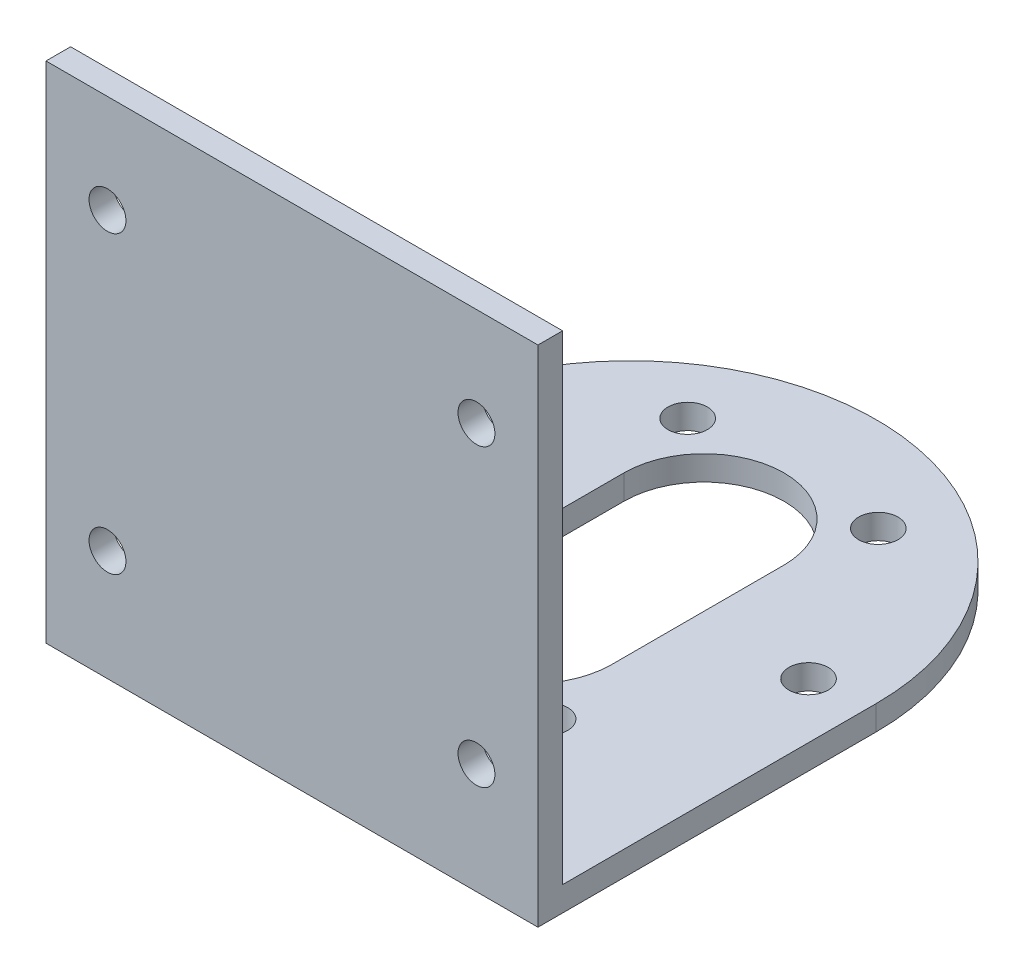
ISO-10303-21;
HEADER;
FILE_DESCRIPTION(('STEP AP214'),'2;1');
FILE_NAME('part.step','',(''),(''),'','','');
FILE_SCHEMA(('AUTOMOTIVE_DESIGN { 1 0 10303 214 1 1 1 1 }'));
ENDSEC;
DATA;
#1=APPLICATION_CONTEXT('core data for automotive mechanical design processes');
#2=APPLICATION_PROTOCOL_DEFINITION('international standard','automotive_design',2000,#1);
#3=PRODUCT_CONTEXT('',#1,'mechanical');
#4=PRODUCT('Part','Part','',(#3));
#5=PRODUCT_RELATED_PRODUCT_CATEGORY('part','',(#4));
#6=PRODUCT_DEFINITION_FORMATION('','',#4);
#7=PRODUCT_DEFINITION_CONTEXT('part definition',#1,'design');
#8=PRODUCT_DEFINITION('design','',#6,#7);
#9=PRODUCT_DEFINITION_SHAPE('','',#8);
#10=(LENGTH_UNIT() NAMED_UNIT(*) SI_UNIT(.MILLI.,.METRE.));
#11=(NAMED_UNIT(*) PLANE_ANGLE_UNIT() SI_UNIT($,.RADIAN.));
#12=(NAMED_UNIT(*) SI_UNIT($,.STERADIAN.) SOLID_ANGLE_UNIT());
#13=UNCERTAINTY_MEASURE_WITH_UNIT(LENGTH_MEASURE(1.E-05),#10,'distance_accuracy_value','');
#14=(GEOMETRIC_REPRESENTATION_CONTEXT(3) GLOBAL_UNCERTAINTY_ASSIGNED_CONTEXT((#13)) GLOBAL_UNIT_ASSIGNED_CONTEXT((#10,
#11,#12)) REPRESENTATION_CONTEXT('',''));
#15=CARTESIAN_POINT('',(0.,0.,0.));
#16=DIRECTION('',(0.,0.,1.));
#17=DIRECTION('',(1.,0.,0.));
#18=AXIS2_PLACEMENT_3D('',#15,#16,#17);
#19=CARTESIAN_POINT('',(-1.95819738407242,2.,2.1643234245011));
#20=DIRECTION('',(0.,1.,0.));
#21=DIRECTION('',(0.,0.,1.));
#22=AXIS2_PLACEMENT_3D('',#19,#20,#21);
#23=PLANE('',#22);
#24=DIRECTION('',(-1.,0.,0.));
#25=VECTOR('',#24,1.);
#26=CARTESIAN_POINT('',(-21.9581973840724,2.,27.6643234245011));
#27=LINE('',#26,#25);
#28=CARTESIAN_POINT('',(18.0418026159276,2.,27.6643234245011));
#29=VERTEX_POINT('',#28);
#30=CARTESIAN_POINT('',(-21.9581973840724,2.,27.6643234245011));
#31=VERTEX_POINT('',#30);
#32=EDGE_CURVE('E55',#29,#31,#27,.T.);
#33=ORIENTED_EDGE('',*,*,#32,.F.);
#34=DIRECTION('',(0.,0.,-1.));
#35=VECTOR('',#34,1.);
#36=CARTESIAN_POINT('',(18.0418026159276,2.,29.6643234245011));
#37=LINE('',#36,#35);
#38=CARTESIAN_POINT('',(18.0418026159276,2.,2.1643234245011));
#39=VERTEX_POINT('',#38);
#40=EDGE_CURVE('E258',#29,#39,#37,.T.);
#41=ORIENTED_EDGE('',*,*,#40,.T.);
#42=CARTESIAN_POINT('',(-1.95819738407242,2.,2.1643234245011));
#43=DIRECTION('',(0.,1.,0.));
#44=DIRECTION('',(0.,0.,1.));
#45=AXIS2_PLACEMENT_3D('',#42,#43,#44);
#46=CIRCLE('',#45,20.);
#47=CARTESIAN_POINT('',(-21.9581973840724,2.,2.1643234245011));
#48=VERTEX_POINT('',#47);
#49=EDGE_CURVE('E250',#39,#48,#46,.T.);
#50=ORIENTED_EDGE('',*,*,#49,.T.);
#51=DIRECTION('',(0.,0.,1.));
#52=VECTOR('',#51,1.);
#53=CARTESIAN_POINT('',(-21.9581973840724,2.,2.1643234245011));
#54=LINE('',#53,#52);
#55=EDGE_CURVE('E254',#48,#31,#54,.T.);
#56=ORIENTED_EDGE('',*,*,#55,.T.);
#57=EDGE_LOOP('',(#33,#41,#50,#56));
#58=FACE_BOUND('',#57,.T.);
#59=CARTESIAN_POINT('',(13.5418026159276,2.,3.1643234245011));
#60=DIRECTION('',(0.,1.,0.));
#61=DIRECTION('',(0.,0.,1.));
#62=AXIS2_PLACEMENT_3D('',#59,#60,#61);
#63=CIRCLE('',#62,1.6);
#64=CARTESIAN_POINT('',(13.5418026159276,2.,4.7643234245011));
#65=VERTEX_POINT('',#64);
#66=EDGE_CURVE('E210',#65,#65,#63,.T.);
#67=ORIENTED_EDGE('',*,*,#66,.F.);
#68=EDGE_LOOP('',(#67));
#69=FACE_BOUND('',#68,.T.);
#70=CARTESIAN_POINT('',(-9.70819738407242,2.,16.5877171831599));
#71=DIRECTION('',(0.,1.,0.));
#72=DIRECTION('',(0.,0.,1.));
#73=AXIS2_PLACEMENT_3D('',#70,#71,#72);
#74=CIRCLE('',#73,1.6);
#75=CARTESIAN_POINT('',(-9.70819738407242,2.,18.1877171831599));
#76=VERTEX_POINT('',#75);
#77=EDGE_CURVE('E226',#76,#76,#74,.T.);
#78=ORIENTED_EDGE('',*,*,#77,.F.);
#79=EDGE_LOOP('',(#78));
#80=FACE_BOUND('',#79,.T.);
#81=CARTESIAN_POINT('',(-9.70819738407242,2.,-10.2590703341577));
#82=DIRECTION('',(0.,1.,0.));
#83=DIRECTION('',(0.,0.,1.));
#84=AXIS2_PLACEMENT_3D('',#81,#82,#83);
#85=CIRCLE('',#84,1.6);
#86=CARTESIAN_POINT('',(-9.70819738407242,2.,-8.65907033415769));
#87=VERTEX_POINT('',#86);
#88=EDGE_CURVE('E242',#87,#87,#85,.T.);
#89=ORIENTED_EDGE('',*,*,#88,.F.);
#90=EDGE_LOOP('',(#89));
#91=FACE_BOUND('',#90,.T.);
#92=CARTESIAN_POINT('',(-17.4581973840724,2.,3.1643234245011));
#93=DIRECTION('',(0.,1.,0.));
#94=DIRECTION('',(0.,0.,1.));
#95=AXIS2_PLACEMENT_3D('',#92,#93,#94);
#96=CIRCLE('',#95,1.6);
#97=CARTESIAN_POINT('',(-17.4581973840724,2.,4.7643234245011));
#98=VERTEX_POINT('',#97);
#99=EDGE_CURVE('E234',#98,#98,#96,.T.);
#100=ORIENTED_EDGE('',*,*,#99,.F.);
#101=EDGE_LOOP('',(#100));
#102=FACE_BOUND('',#101,.T.);
#103=CARTESIAN_POINT('',(5.79180261592758,2.,16.5877171831599));
#104=DIRECTION('',(0.,1.,0.));
#105=DIRECTION('',(0.,0.,1.));
#106=AXIS2_PLACEMENT_3D('',#103,#104,#105);
#107=CIRCLE('',#106,1.6);
#108=CARTESIAN_POINT('',(5.79180261592758,2.,18.1877171831599));
#109=VERTEX_POINT('',#108);
#110=EDGE_CURVE('E218',#109,#109,#107,.T.);
#111=ORIENTED_EDGE('',*,*,#110,.F.);
#112=EDGE_LOOP('',(#111));
#113=FACE_BOUND('',#112,.T.);
#114=CARTESIAN_POINT('',(5.79180261592758,2.,-10.2590703341577));
#115=DIRECTION('',(0.,1.,0.));
#116=DIRECTION('',(0.,0.,1.));
#117=AXIS2_PLACEMENT_3D('',#114,#115,#116);
#118=CIRCLE('',#117,1.6);
#119=CARTESIAN_POINT('',(5.79180261592758,2.,-8.65907033415769));
#120=VERTEX_POINT('',#119);
#121=EDGE_CURVE('E202',#120,#120,#118,.T.);
#122=ORIENTED_EDGE('',*,*,#121,.F.);
#123=EDGE_LOOP('',(#122));
#124=FACE_BOUND('',#123,.T.);
#125=DIRECTION('',(0.,0.,1.));
#126=VECTOR('',#125,1.);
#127=CARTESIAN_POINT('',(-8.45819738407242,2.,-3.83567657549889));
#128=LINE('',#127,#126);
#129=CARTESIAN_POINT('',(-8.45819738407242,2.,-3.83567657549889));
#130=VERTEX_POINT('',#129);
#131=CARTESIAN_POINT('',(-8.45819738407242,2.,10.1643234245011));
#132=VERTEX_POINT('',#131);
#133=EDGE_CURVE('E164',#130,#132,#128,.T.);
#134=ORIENTED_EDGE('',*,*,#133,.F.);
#135=CARTESIAN_POINT('',(-1.95819738407242,2.,-3.83567657549889));
#136=DIRECTION('',(0.,1.,0.));
#137=DIRECTION('',(0.,0.,1.));
#138=AXIS2_PLACEMENT_3D('',#135,#136,#137);
#139=CIRCLE('',#138,6.5);
#140=CARTESIAN_POINT('',(4.54180261592758,2.,-3.83567657549889));
#141=VERTEX_POINT('',#140);
#142=EDGE_CURVE('E161',#141,#130,#139,.T.);
#143=ORIENTED_EDGE('',*,*,#142,.F.);
#144=DIRECTION('',(0.,0.,-1.));
#145=VECTOR('',#144,1.);
#146=CARTESIAN_POINT('',(4.54180261592758,2.,-3.83567657549889));
#147=LINE('',#146,#145);
#148=CARTESIAN_POINT('',(4.54180261592758,2.,10.1643234245011));
#149=VERTEX_POINT('',#148);
#150=EDGE_CURVE('E171',#149,#141,#147,.T.);
#151=ORIENTED_EDGE('',*,*,#150,.F.);
#152=CARTESIAN_POINT('',(-1.95819738407242,2.,10.1643234245011));
#153=DIRECTION('',(0.,1.,0.));
#154=DIRECTION('',(0.,0.,1.));
#155=AXIS2_PLACEMENT_3D('',#152,#153,#154);
#156=CIRCLE('',#155,6.5);
#157=EDGE_CURVE('E168',#132,#149,#156,.T.);
#158=ORIENTED_EDGE('',*,*,#157,.F.);
#159=EDGE_LOOP('',(#134,#143,#151,#158));
#160=FACE_BOUND('',#159,.T.);
#161=ADVANCED_FACE('F39',(#58,#69,#80,#91,#102,#113,#124,#160),#23,.T.);
#162=CARTESIAN_POINT('',(-1.95819738407242,0.,2.1643234245011));
#163=DIRECTION('',(0.,1.,0.));
#164=DIRECTION('',(0.,0.,1.));
#165=AXIS2_PLACEMENT_3D('',#162,#163,#164);
#166=PLANE('',#165);
#167=CARTESIAN_POINT('',(5.79180261592758,0.,-10.2590703341577));
#168=DIRECTION('',(0.,1.,0.));
#169=DIRECTION('',(0.,0.,1.));
#170=AXIS2_PLACEMENT_3D('',#167,#168,#169);
#171=CIRCLE('',#170,1.6);
#172=CARTESIAN_POINT('',(5.79180261592758,0.,-8.65907033415769));
#173=VERTEX_POINT('',#172);
#174=EDGE_CURVE('E201',#173,#173,#171,.T.);
#175=ORIENTED_EDGE('',*,*,#174,.T.);
#176=EDGE_LOOP('',(#175));
#177=FACE_BOUND('',#176,.T.);
#178=CARTESIAN_POINT('',(13.5418026159276,0.,3.1643234245011));
#179=DIRECTION('',(0.,1.,0.));
#180=DIRECTION('',(0.,0.,1.));
#181=AXIS2_PLACEMENT_3D('',#178,#179,#180);
#182=CIRCLE('',#181,1.6);
#183=CARTESIAN_POINT('',(13.5418026159276,0.,4.7643234245011));
#184=VERTEX_POINT('',#183);
#185=EDGE_CURVE('E206',#184,#184,#182,.T.);
#186=ORIENTED_EDGE('',*,*,#185,.T.);
#187=EDGE_LOOP('',(#186));
#188=FACE_BOUND('',#187,.T.);
#189=CARTESIAN_POINT('',(5.79180261592758,0.,16.5877171831599));
#190=DIRECTION('',(0.,1.,0.));
#191=DIRECTION('',(0.,0.,1.));
#192=AXIS2_PLACEMENT_3D('',#189,#190,#191);
#193=CIRCLE('',#192,1.6);
#194=CARTESIAN_POINT('',(5.79180261592758,0.,18.1877171831599));
#195=VERTEX_POINT('',#194);
#196=EDGE_CURVE('E214',#195,#195,#193,.T.);
#197=ORIENTED_EDGE('',*,*,#196,.T.);
#198=EDGE_LOOP('',(#197));
#199=FACE_BOUND('',#198,.T.);
#200=CARTESIAN_POINT('',(-9.70819738407242,0.,16.5877171831599));
#201=DIRECTION('',(0.,1.,0.));
#202=DIRECTION('',(0.,0.,1.));
#203=AXIS2_PLACEMENT_3D('',#200,#201,#202);
#204=CIRCLE('',#203,1.6);
#205=CARTESIAN_POINT('',(-9.70819738407242,0.,18.1877171831599));
#206=VERTEX_POINT('',#205);
#207=EDGE_CURVE('E222',#206,#206,#204,.T.);
#208=ORIENTED_EDGE('',*,*,#207,.T.);
#209=EDGE_LOOP('',(#208));
#210=FACE_BOUND('',#209,.T.);
#211=CARTESIAN_POINT('',(-17.4581973840724,0.,3.1643234245011));
#212=DIRECTION('',(0.,1.,0.));
#213=DIRECTION('',(0.,0.,1.));
#214=AXIS2_PLACEMENT_3D('',#211,#212,#213);
#215=CIRCLE('',#214,1.6);
#216=CARTESIAN_POINT('',(-17.4581973840724,0.,4.7643234245011));
#217=VERTEX_POINT('',#216);
#218=EDGE_CURVE('E230',#217,#217,#215,.T.);
#219=ORIENTED_EDGE('',*,*,#218,.T.);
#220=EDGE_LOOP('',(#219));
#221=FACE_BOUND('',#220,.T.);
#222=CARTESIAN_POINT('',(-9.70819738407242,0.,-10.2590703341577));
#223=DIRECTION('',(0.,1.,0.));
#224=DIRECTION('',(0.,0.,1.));
#225=AXIS2_PLACEMENT_3D('',#222,#223,#224);
#226=CIRCLE('',#225,1.6);
#227=CARTESIAN_POINT('',(-9.70819738407242,0.,-8.65907033415769));
#228=VERTEX_POINT('',#227);
#229=EDGE_CURVE('E238',#228,#228,#226,.T.);
#230=ORIENTED_EDGE('',*,*,#229,.T.);
#231=EDGE_LOOP('',(#230));
#232=FACE_BOUND('',#231,.T.);
#233=CARTESIAN_POINT('',(-1.95819738407242,0.,2.1643234245011));
#234=DIRECTION('',(0.,1.,0.));
#235=DIRECTION('',(0.,0.,1.));
#236=AXIS2_PLACEMENT_3D('',#233,#234,#235);
#237=CIRCLE('',#236,20.);
#238=CARTESIAN_POINT('',(18.0418026159276,0.,2.1643234245011));
#239=VERTEX_POINT('',#238);
#240=CARTESIAN_POINT('',(-21.9581973840724,0.,2.1643234245011));
#241=VERTEX_POINT('',#240);
#242=EDGE_CURVE('E246',#239,#241,#237,.T.);
#243=ORIENTED_EDGE('',*,*,#242,.F.);
#244=DIRECTION('',(0.,0.,-1.));
#245=VECTOR('',#244,1.);
#246=CARTESIAN_POINT('',(18.0418026159276,0.,29.6643234245011));
#247=LINE('',#246,#245);
#248=CARTESIAN_POINT('',(18.0418026159276,0.,29.6643234245011));
#249=VERTEX_POINT('',#248);
#250=EDGE_CURVE('E255',#249,#239,#247,.T.);
#251=ORIENTED_EDGE('',*,*,#250,.F.);
#252=DIRECTION('',(1.,0.,0.));
#253=VECTOR('',#252,1.);
#254=CARTESIAN_POINT('',(-21.9581973840724,0.,29.6643234245011));
#255=LINE('',#254,#253);
#256=CARTESIAN_POINT('',(-21.9581973840724,0.,29.6643234245011));
#257=VERTEX_POINT('',#256);
#258=EDGE_CURVE('E267',#257,#249,#255,.T.);
#259=ORIENTED_EDGE('',*,*,#258,.F.);
#260=DIRECTION('',(0.,0.,1.));
#261=VECTOR('',#260,1.);
#262=CARTESIAN_POINT('',(-21.9581973840724,0.,2.1643234245011));
#263=LINE('',#262,#261);
#264=EDGE_CURVE('E122',#241,#257,#263,.T.);
#265=ORIENTED_EDGE('',*,*,#264,.F.);
#266=EDGE_LOOP('',(#243,#251,#259,#265));
#267=FACE_BOUND('',#266,.T.);
#268=CARTESIAN_POINT('',(-1.95819738407242,0.,-3.83567657549889));
#269=DIRECTION('',(0.,1.,0.));
#270=DIRECTION('',(0.,0.,1.));
#271=AXIS2_PLACEMENT_3D('',#268,#269,#270);
#272=CIRCLE('',#271,6.5);
#273=CARTESIAN_POINT('',(4.54180261592758,0.,-3.83567657549889));
#274=VERTEX_POINT('',#273);
#275=CARTESIAN_POINT('',(-8.45819738407242,0.,-3.83567657549889));
#276=VERTEX_POINT('',#275);
#277=EDGE_CURVE('E160',#274,#276,#272,.T.);
#278=ORIENTED_EDGE('',*,*,#277,.T.);
#279=DIRECTION('',(0.,0.,1.));
#280=VECTOR('',#279,1.);
#281=CARTESIAN_POINT('',(-8.45819738407242,0.,-3.83567657549889));
#282=LINE('',#281,#280);
#283=CARTESIAN_POINT('',(-8.45819738407242,0.,10.1643234245011));
#284=VERTEX_POINT('',#283);
#285=EDGE_CURVE('E178',#276,#284,#282,.T.);
#286=ORIENTED_EDGE('',*,*,#285,.T.);
#287=CARTESIAN_POINT('',(-1.95819738407242,0.,10.1643234245011));
#288=DIRECTION('',(0.,1.,0.));
#289=DIRECTION('',(0.,0.,1.));
#290=AXIS2_PLACEMENT_3D('',#287,#288,#289);
#291=CIRCLE('',#290,6.5);
#292=CARTESIAN_POINT('',(4.54180261592758,0.,10.1643234245011));
#293=VERTEX_POINT('',#292);
#294=EDGE_CURVE('E182',#284,#293,#291,.T.);
#295=ORIENTED_EDGE('',*,*,#294,.T.);
#296=DIRECTION('',(0.,0.,-1.));
#297=VECTOR('',#296,1.);
#298=CARTESIAN_POINT('',(4.54180261592758,0.,-3.83567657549889));
#299=LINE('',#298,#297);
#300=EDGE_CURVE('E165',#293,#274,#299,.T.);
#301=ORIENTED_EDGE('',*,*,#300,.T.);
#302=EDGE_LOOP('',(#278,#286,#295,#301));
#303=FACE_BOUND('',#302,.T.);
#304=ADVANCED_FACE('F283',(#177,#188,#199,#210,#221,#232,#267,#303),#166,.F.);
#305=CARTESIAN_POINT('',(-1.95819738407242,2.,2.1643234245011));
#306=DIRECTION('',(0.,-1.,0.));
#307=DIRECTION('',(0.,0.,-1.));
#308=AXIS2_PLACEMENT_3D('',#305,#306,#307);
#309=CYLINDRICAL_SURFACE('',#308,20.);
#310=ORIENTED_EDGE('',*,*,#242,.T.);
#311=DIRECTION('',(0.,-1.,0.));
#312=VECTOR('',#311,1.);
#313=CARTESIAN_POINT('',(-21.9581973840724,2.,2.1643234245011));
#314=LINE('',#313,#312);
#315=EDGE_CURVE('E11',#48,#241,#314,.T.);
#316=ORIENTED_EDGE('',*,*,#315,.F.);
#317=ORIENTED_EDGE('',*,*,#49,.F.);
#318=DIRECTION('',(0.,-1.,0.));
#319=VECTOR('',#318,1.);
#320=CARTESIAN_POINT('',(18.0418026159276,2.,2.1643234245011));
#321=LINE('',#320,#319);
#322=EDGE_CURVE('E261',#39,#239,#321,.T.);
#323=ORIENTED_EDGE('',*,*,#322,.T.);
#324=EDGE_LOOP('',(#310,#316,#317,#323));
#325=FACE_BOUND('',#324,.T.);
#326=ADVANCED_FACE('F41',(#325),#309,.T.);
#327=CARTESIAN_POINT('',(-21.9581973840724,2.,2.1643234245011));
#328=DIRECTION('',(1.,0.,0.));
#329=DIRECTION('',(0.,0.,-1.));
#330=AXIS2_PLACEMENT_3D('',#327,#328,#329);
#331=PLANE('',#330);
#332=ORIENTED_EDGE('',*,*,#264,.T.);
#333=DIRECTION('',(0.,-1.,0.));
#334=VECTOR('',#333,1.);
#335=CARTESIAN_POINT('',(-21.9581973840724,2.,29.6643234245011));
#336=LINE('',#335,#334);
#337=CARTESIAN_POINT('',(-21.9581973840724,41.,29.6643234245011));
#338=VERTEX_POINT('',#337);
#339=EDGE_CURVE('E48',#338,#257,#336,.T.);
#340=ORIENTED_EDGE('',*,*,#339,.F.);
#341=DIRECTION('',(0.,0.,1.));
#342=VECTOR('',#341,1.);
#343=CARTESIAN_POINT('',(-21.9581973840724,41.,29.6643234245011));
#344=LINE('',#343,#342);
#345=CARTESIAN_POINT('',(-21.9581973840724,41.,27.6643234245011));
#346=VERTEX_POINT('',#345);
#347=EDGE_CURVE('E121',#346,#338,#344,.T.);
#348=ORIENTED_EDGE('',*,*,#347,.F.);
#349=DIRECTION('',(0.,-1.,0.));
#350=VECTOR('',#349,1.);
#351=CARTESIAN_POINT('',(-21.9581973840724,41.,27.6643234245011));
#352=LINE('',#351,#350);
#353=EDGE_CURVE('E152',#346,#31,#352,.T.);
#354=ORIENTED_EDGE('',*,*,#353,.T.);
#355=ORIENTED_EDGE('',*,*,#55,.F.);
#356=ORIENTED_EDGE('',*,*,#315,.T.);
#357=EDGE_LOOP('',(#332,#340,#348,#354,#355,#356));
#358=FACE_BOUND('',#357,.T.);
#359=ADVANCED_FACE('F118',(#358),#331,.F.);
#360=CARTESIAN_POINT('',(-21.9581973840724,2.,29.6643234245011));
#361=DIRECTION('',(0.,0.,-1.));
#362=DIRECTION('',(-1.,0.,0.));
#363=AXIS2_PLACEMENT_3D('',#360,#361,#362);
#364=PLANE('',#363);
#365=CARTESIAN_POINT('',(13.0418026159276,9.,29.6643234245011));
#366=DIRECTION('',(0.,0.,-1.));
#367=DIRECTION('',(-1.,0.,0.));
#368=AXIS2_PLACEMENT_3D('',#365,#366,#367);
#369=CIRCLE('',#368,1.5);
#370=CARTESIAN_POINT('',(11.5418026159276,9.,29.6643234245011));
#371=VERTEX_POINT('',#370);
#372=EDGE_CURVE('E463',#371,#371,#369,.T.);
#373=ORIENTED_EDGE('',*,*,#372,.T.);
#374=EDGE_LOOP('',(#373));
#375=FACE_BOUND('',#374,.T.);
#376=CARTESIAN_POINT('',(-16.9581973840724,33.,29.6643234245011));
#377=DIRECTION('',(0.,0.,-1.));
#378=DIRECTION('',(-1.,0.,0.));
#379=AXIS2_PLACEMENT_3D('',#376,#377,#378);
#380=CIRCLE('',#379,1.5);
#381=CARTESIAN_POINT('',(-18.4581973840724,33.,29.6643234245011));
#382=VERTEX_POINT('',#381);
#383=EDGE_CURVE('E468',#382,#382,#380,.T.);
#384=ORIENTED_EDGE('',*,*,#383,.T.);
#385=EDGE_LOOP('',(#384));
#386=FACE_BOUND('',#385,.T.);
#387=CARTESIAN_POINT('',(-16.9581973840724,9.,29.6643234245011));
#388=DIRECTION('',(0.,0.,-1.));
#389=DIRECTION('',(-1.,0.,0.));
#390=AXIS2_PLACEMENT_3D('',#387,#388,#389);
#391=CIRCLE('',#390,1.5);
#392=CARTESIAN_POINT('',(-18.4581973840724,9.,29.6643234245011));
#393=VERTEX_POINT('',#392);
#394=EDGE_CURVE('E480',#393,#393,#391,.T.);
#395=ORIENTED_EDGE('',*,*,#394,.T.);
#396=EDGE_LOOP('',(#395));
#397=FACE_BOUND('',#396,.T.);
#398=CARTESIAN_POINT('',(13.0418026159276,33.,29.6643234245011));
#399=DIRECTION('',(0.,0.,-1.));
#400=DIRECTION('',(-1.,0.,0.));
#401=AXIS2_PLACEMENT_3D('',#398,#399,#400);
#402=CIRCLE('',#401,1.5);
#403=CARTESIAN_POINT('',(11.5418026159276,33.,29.6643234245011));
#404=VERTEX_POINT('',#403);
#405=EDGE_CURVE('E143',#404,#404,#402,.T.);
#406=ORIENTED_EDGE('',*,*,#405,.T.);
#407=EDGE_LOOP('',(#406));
#408=FACE_BOUND('',#407,.T.);
#409=ORIENTED_EDGE('',*,*,#258,.T.);
#410=DIRECTION('',(0.,-1.,0.));
#411=VECTOR('',#410,1.);
#412=CARTESIAN_POINT('',(18.0418026159276,2.,29.6643234245011));
#413=LINE('',#412,#411);
#414=CARTESIAN_POINT('',(18.0418026159276,41.,29.6643234245011));
#415=VERTEX_POINT('',#414);
#416=EDGE_CURVE('E126',#415,#249,#413,.T.);
#417=ORIENTED_EDGE('',*,*,#416,.F.);
#418=DIRECTION('',(1.,0.,0.));
#419=VECTOR('',#418,1.);
#420=CARTESIAN_POINT('',(-21.9581973840724,41.,29.6643234245011));
#421=LINE('',#420,#419);
#422=EDGE_CURVE('E128',#338,#415,#421,.T.);
#423=ORIENTED_EDGE('',*,*,#422,.F.);
#424=ORIENTED_EDGE('',*,*,#339,.T.);
#425=EDGE_LOOP('',(#409,#417,#423,#424));
#426=FACE_BOUND('',#425,.T.);
#427=ADVANCED_FACE('F129',(#375,#386,#397,#408,#426),#364,.F.);
#428=CARTESIAN_POINT('',(18.0418026159276,2.,29.6643234245011));
#429=DIRECTION('',(-1.,0.,0.));
#430=DIRECTION('',(0.,0.,1.));
#431=AXIS2_PLACEMENT_3D('',#428,#429,#430);
#432=PLANE('',#431);
#433=ORIENTED_EDGE('',*,*,#250,.T.);
#434=ORIENTED_EDGE('',*,*,#322,.F.);
#435=ORIENTED_EDGE('',*,*,#40,.F.);
#436=DIRECTION('',(0.,-1.,0.));
#437=VECTOR('',#436,1.);
#438=CARTESIAN_POINT('',(18.0418026159276,41.,27.6643234245011));
#439=LINE('',#438,#437);
#440=CARTESIAN_POINT('',(18.0418026159276,41.,27.6643234245011));
#441=VERTEX_POINT('',#440);
#442=EDGE_CURVE('E156',#441,#29,#439,.T.);
#443=ORIENTED_EDGE('',*,*,#442,.F.);
#444=DIRECTION('',(0.,0.,-1.));
#445=VECTOR('',#444,1.);
#446=CARTESIAN_POINT('',(18.0418026159276,41.,29.6643234245011));
#447=LINE('',#446,#445);
#448=EDGE_CURVE('E134',#415,#441,#447,.T.);
#449=ORIENTED_EDGE('',*,*,#448,.F.);
#450=ORIENTED_EDGE('',*,*,#416,.T.);
#451=EDGE_LOOP('',(#433,#434,#435,#443,#449,#450));
#452=FACE_BOUND('',#451,.T.);
#453=ADVANCED_FACE('F278',(#452),#432,.F.);
#454=CARTESIAN_POINT('',(-9.70819738407242,2.,-10.2590703341577));
#455=DIRECTION('',(0.,-1.,0.));
#456=DIRECTION('',(0.,0.,-1.));
#457=AXIS2_PLACEMENT_3D('',#454,#455,#456);
#458=CYLINDRICAL_SURFACE('',#457,1.6);
#459=ORIENTED_EDGE('',*,*,#88,.T.);
#460=EDGE_LOOP('',(#459));
#461=FACE_BOUND('',#460,.T.);
#462=ORIENTED_EDGE('',*,*,#229,.F.);
#463=EDGE_LOOP('',(#462));
#464=FACE_BOUND('',#463,.T.);
#465=ADVANCED_FACE('F354',(#461,#464),#458,.F.);
#466=CARTESIAN_POINT('',(-17.4581973840724,2.,3.1643234245011));
#467=DIRECTION('',(0.,-1.,0.));
#468=DIRECTION('',(0.,0.,-1.));
#469=AXIS2_PLACEMENT_3D('',#466,#467,#468);
#470=CYLINDRICAL_SURFACE('',#469,1.6);
#471=ORIENTED_EDGE('',*,*,#99,.T.);
#472=EDGE_LOOP('',(#471));
#473=FACE_BOUND('',#472,.T.);
#474=ORIENTED_EDGE('',*,*,#218,.F.);
#475=EDGE_LOOP('',(#474));
#476=FACE_BOUND('',#475,.T.);
#477=ADVANCED_FACE('F350',(#473,#476),#470,.F.);
#478=CARTESIAN_POINT('',(-9.70819738407242,2.,16.5877171831599));
#479=DIRECTION('',(0.,-1.,0.));
#480=DIRECTION('',(0.,0.,-1.));
#481=AXIS2_PLACEMENT_3D('',#478,#479,#480);
#482=CYLINDRICAL_SURFACE('',#481,1.6);
#483=ORIENTED_EDGE('',*,*,#77,.T.);
#484=EDGE_LOOP('',(#483));
#485=FACE_BOUND('',#484,.T.);
#486=ORIENTED_EDGE('',*,*,#207,.F.);
#487=EDGE_LOOP('',(#486));
#488=FACE_BOUND('',#487,.T.);
#489=ADVANCED_FACE('F346',(#485,#488),#482,.F.);
#490=CARTESIAN_POINT('',(5.79180261592758,2.,16.5877171831599));
#491=DIRECTION('',(0.,-1.,0.));
#492=DIRECTION('',(0.,0.,-1.));
#493=AXIS2_PLACEMENT_3D('',#490,#491,#492);
#494=CYLINDRICAL_SURFACE('',#493,1.6);
#495=ORIENTED_EDGE('',*,*,#110,.T.);
#496=EDGE_LOOP('',(#495));
#497=FACE_BOUND('',#496,.T.);
#498=ORIENTED_EDGE('',*,*,#196,.F.);
#499=EDGE_LOOP('',(#498));
#500=FACE_BOUND('',#499,.T.);
#501=ADVANCED_FACE('F342',(#497,#500),#494,.F.);
#502=CARTESIAN_POINT('',(13.5418026159276,2.,3.1643234245011));
#503=DIRECTION('',(0.,-1.,0.));
#504=DIRECTION('',(0.,0.,-1.));
#505=AXIS2_PLACEMENT_3D('',#502,#503,#504);
#506=CYLINDRICAL_SURFACE('',#505,1.6);
#507=ORIENTED_EDGE('',*,*,#66,.T.);
#508=EDGE_LOOP('',(#507));
#509=FACE_BOUND('',#508,.T.);
#510=ORIENTED_EDGE('',*,*,#185,.F.);
#511=EDGE_LOOP('',(#510));
#512=FACE_BOUND('',#511,.T.);
#513=ADVANCED_FACE('F338',(#509,#512),#506,.F.);
#514=CARTESIAN_POINT('',(5.79180261592758,2.,-10.2590703341577));
#515=DIRECTION('',(0.,-1.,0.));
#516=DIRECTION('',(0.,0.,-1.));
#517=AXIS2_PLACEMENT_3D('',#514,#515,#516);
#518=CYLINDRICAL_SURFACE('',#517,1.6);
#519=ORIENTED_EDGE('',*,*,#121,.T.);
#520=EDGE_LOOP('',(#519));
#521=FACE_BOUND('',#520,.T.);
#522=ORIENTED_EDGE('',*,*,#174,.F.);
#523=EDGE_LOOP('',(#522));
#524=FACE_BOUND('',#523,.T.);
#525=ADVANCED_FACE('F335',(#521,#524),#518,.F.);
#526=CARTESIAN_POINT('',(-1.95819738407242,2.,-3.83567657549889));
#527=DIRECTION('',(0.,-1.,0.));
#528=DIRECTION('',(0.,0.,-1.));
#529=AXIS2_PLACEMENT_3D('',#526,#527,#528);
#530=CYLINDRICAL_SURFACE('',#529,6.5);
#531=ORIENTED_EDGE('',*,*,#277,.F.);
#532=DIRECTION('',(0.,-1.,0.));
#533=VECTOR('',#532,1.);
#534=CARTESIAN_POINT('',(4.54180261592758,2.,-3.83567657549889));
#535=LINE('',#534,#533);
#536=EDGE_CURVE('E174',#141,#274,#535,.T.);
#537=ORIENTED_EDGE('',*,*,#536,.F.);
#538=ORIENTED_EDGE('',*,*,#142,.T.);
#539=DIRECTION('',(0.,-1.,0.));
#540=VECTOR('',#539,1.);
#541=CARTESIAN_POINT('',(-8.45819738407242,2.,-3.83567657549889));
#542=LINE('',#541,#540);
#543=EDGE_CURVE('E197',#130,#276,#542,.T.);
#544=ORIENTED_EDGE('',*,*,#543,.T.);
#545=EDGE_LOOP('',(#531,#537,#538,#544));
#546=FACE_BOUND('',#545,.T.);
#547=ADVANCED_FACE('F317',(#546),#530,.F.);
#548=CARTESIAN_POINT('',(-8.45819738407242,2.,-3.83567657549889));
#549=DIRECTION('',(1.,0.,0.));
#550=DIRECTION('',(0.,0.,-1.));
#551=AXIS2_PLACEMENT_3D('',#548,#549,#550);
#552=PLANE('',#551);
#553=ORIENTED_EDGE('',*,*,#285,.F.);
#554=ORIENTED_EDGE('',*,*,#543,.F.);
#555=ORIENTED_EDGE('',*,*,#133,.T.);
#556=DIRECTION('',(0.,-1.,0.));
#557=VECTOR('',#556,1.);
#558=CARTESIAN_POINT('',(-8.45819738407242,2.,10.1643234245011));
#559=LINE('',#558,#557);
#560=EDGE_CURVE('E194',#132,#284,#559,.T.);
#561=ORIENTED_EDGE('',*,*,#560,.T.);
#562=EDGE_LOOP('',(#553,#554,#555,#561));
#563=FACE_BOUND('',#562,.T.);
#564=ADVANCED_FACE('F312',(#563),#552,.T.);
#565=CARTESIAN_POINT('',(-1.95819738407242,2.,10.1643234245011));
#566=DIRECTION('',(0.,-1.,0.));
#567=DIRECTION('',(0.,0.,-1.));
#568=AXIS2_PLACEMENT_3D('',#565,#566,#567);
#569=CYLINDRICAL_SURFACE('',#568,6.5);
#570=ORIENTED_EDGE('',*,*,#294,.F.);
#571=ORIENTED_EDGE('',*,*,#560,.F.);
#572=ORIENTED_EDGE('',*,*,#157,.T.);
#573=DIRECTION('',(0.,-1.,0.));
#574=VECTOR('',#573,1.);
#575=CARTESIAN_POINT('',(4.54180261592758,2.,10.1643234245011));
#576=LINE('',#575,#574);
#577=EDGE_CURVE('E63',#149,#293,#576,.T.);
#578=ORIENTED_EDGE('',*,*,#577,.T.);
#579=EDGE_LOOP('',(#570,#571,#572,#578));
#580=FACE_BOUND('',#579,.T.);
#581=ADVANCED_FACE('F315',(#580),#569,.F.);
#582=CARTESIAN_POINT('',(4.54180261592758,2.,-3.83567657549889));
#583=DIRECTION('',(-1.,0.,0.));
#584=DIRECTION('',(0.,0.,1.));
#585=AXIS2_PLACEMENT_3D('',#582,#583,#584);
#586=PLANE('',#585);
#587=ORIENTED_EDGE('',*,*,#300,.F.);
#588=ORIENTED_EDGE('',*,*,#577,.F.);
#589=ORIENTED_EDGE('',*,*,#150,.T.);
#590=ORIENTED_EDGE('',*,*,#536,.T.);
#591=EDGE_LOOP('',(#587,#588,#589,#590));
#592=FACE_BOUND('',#591,.T.);
#593=ADVANCED_FACE('F319',(#592),#586,.T.);
#594=CARTESIAN_POINT('',(-21.9581973840724,41.,27.6643234245011));
#595=DIRECTION('',(0.,0.,1.));
#596=DIRECTION('',(1.,0.,0.));
#597=AXIS2_PLACEMENT_3D('',#594,#595,#596);
#598=PLANE('',#597);
#599=CARTESIAN_POINT('',(13.0418026159276,9.,27.6643234245011));
#600=DIRECTION('',(0.,0.,-1.));
#601=DIRECTION('',(-1.,0.,0.));
#602=AXIS2_PLACEMENT_3D('',#599,#600,#601);
#603=CIRCLE('',#602,1.5);
#604=CARTESIAN_POINT('',(11.5418026159276,9.,27.6643234245011));
#605=VERTEX_POINT('',#604);
#606=EDGE_CURVE('E466',#605,#605,#603,.T.);
#607=ORIENTED_EDGE('',*,*,#606,.F.);
#608=EDGE_LOOP('',(#607));
#609=FACE_BOUND('',#608,.T.);
#610=CARTESIAN_POINT('',(-16.9581973840724,33.,27.6643234245011));
#611=DIRECTION('',(0.,0.,-1.));
#612=DIRECTION('',(-1.,0.,0.));
#613=AXIS2_PLACEMENT_3D('',#610,#611,#612);
#614=CIRCLE('',#613,1.5);
#615=CARTESIAN_POINT('',(-18.4581973840724,33.,27.6643234245011));
#616=VERTEX_POINT('',#615);
#617=EDGE_CURVE('E474',#616,#616,#614,.T.);
#618=ORIENTED_EDGE('',*,*,#617,.F.);
#619=EDGE_LOOP('',(#618));
#620=FACE_BOUND('',#619,.T.);
#621=CARTESIAN_POINT('',(-16.9581973840724,9.,27.6643234245011));
#622=DIRECTION('',(0.,0.,-1.));
#623=DIRECTION('',(-1.,0.,0.));
#624=AXIS2_PLACEMENT_3D('',#621,#622,#623);
#625=CIRCLE('',#624,1.5);
#626=CARTESIAN_POINT('',(-18.4581973840724,9.,27.6643234245011));
#627=VERTEX_POINT('',#626);
#628=EDGE_CURVE('E494',#627,#627,#625,.T.);
#629=ORIENTED_EDGE('',*,*,#628,.F.);
#630=EDGE_LOOP('',(#629));
#631=FACE_BOUND('',#630,.T.);
#632=CARTESIAN_POINT('',(13.0418026159276,33.,27.6643234245011));
#633=DIRECTION('',(0.,0.,-1.));
#634=DIRECTION('',(-1.,0.,0.));
#635=AXIS2_PLACEMENT_3D('',#632,#633,#634);
#636=CIRCLE('',#635,1.5);
#637=CARTESIAN_POINT('',(11.5418026159276,33.,27.6643234245011));
#638=VERTEX_POINT('',#637);
#639=EDGE_CURVE('E146',#638,#638,#636,.T.);
#640=ORIENTED_EDGE('',*,*,#639,.F.);
#641=EDGE_LOOP('',(#640));
#642=FACE_BOUND('',#641,.T.);
#643=ORIENTED_EDGE('',*,*,#32,.T.);
#644=ORIENTED_EDGE('',*,*,#353,.F.);
#645=DIRECTION('',(-1.,0.,0.));
#646=VECTOR('',#645,1.);
#647=CARTESIAN_POINT('',(-21.9581973840724,41.,27.6643234245011));
#648=LINE('',#647,#646);
#649=EDGE_CURVE('E138',#441,#346,#648,.T.);
#650=ORIENTED_EDGE('',*,*,#649,.F.);
#651=ORIENTED_EDGE('',*,*,#442,.T.);
#652=EDGE_LOOP('',(#643,#644,#650,#651));
#653=FACE_BOUND('',#652,.T.);
#654=ADVANCED_FACE('F289',(#609,#620,#631,#642,#653),#598,.F.);
#655=CARTESIAN_POINT('',(0.,41.,0.));
#656=DIRECTION('',(0.,-1.,0.));
#657=DIRECTION('',(0.,0.,-1.));
#658=AXIS2_PLACEMENT_3D('',#655,#656,#657);
#659=PLANE('',#658);
#660=ORIENTED_EDGE('',*,*,#347,.T.);
#661=ORIENTED_EDGE('',*,*,#422,.T.);
#662=ORIENTED_EDGE('',*,*,#448,.T.);
#663=ORIENTED_EDGE('',*,*,#649,.T.);
#664=EDGE_LOOP('',(#660,#661,#662,#663));
#665=FACE_BOUND('',#664,.T.);
#666=ADVANCED_FACE('F136',(#665),#659,.F.);
#667=CARTESIAN_POINT('',(13.0418026159276,33.,29.6643234245011));
#668=DIRECTION('',(0.,0.,-1.));
#669=DIRECTION('',(-1.,0.,0.));
#670=AXIS2_PLACEMENT_3D('',#667,#668,#669);
#671=CYLINDRICAL_SURFACE('',#670,1.5);
#672=ORIENTED_EDGE('',*,*,#405,.F.);
#673=EDGE_LOOP('',(#672));
#674=FACE_BOUND('',#673,.T.);
#675=ORIENTED_EDGE('',*,*,#639,.T.);
#676=EDGE_LOOP('',(#675));
#677=FACE_BOUND('',#676,.T.);
#678=ADVANCED_FACE('F407',(#674,#677),#671,.F.);
#679=CARTESIAN_POINT('',(-16.9581973840724,9.,29.6643234245011));
#680=DIRECTION('',(0.,0.,-1.));
#681=DIRECTION('',(-1.,0.,0.));
#682=AXIS2_PLACEMENT_3D('',#679,#680,#681);
#683=CYLINDRICAL_SURFACE('',#682,1.5);
#684=ORIENTED_EDGE('',*,*,#394,.F.);
#685=EDGE_LOOP('',(#684));
#686=FACE_BOUND('',#685,.T.);
#687=ORIENTED_EDGE('',*,*,#628,.T.);
#688=EDGE_LOOP('',(#687));
#689=FACE_BOUND('',#688,.T.);
#690=ADVANCED_FACE('F426',(#686,#689),#683,.F.);
#691=CARTESIAN_POINT('',(-16.9581973840724,33.,29.6643234245011));
#692=DIRECTION('',(0.,0.,-1.));
#693=DIRECTION('',(-1.,0.,0.));
#694=AXIS2_PLACEMENT_3D('',#691,#692,#693);
#695=CYLINDRICAL_SURFACE('',#694,1.5);
#696=ORIENTED_EDGE('',*,*,#383,.F.);
#697=EDGE_LOOP('',(#696));
#698=FACE_BOUND('',#697,.T.);
#699=ORIENTED_EDGE('',*,*,#617,.T.);
#700=EDGE_LOOP('',(#699));
#701=FACE_BOUND('',#700,.T.);
#702=ADVANCED_FACE('F436',(#698,#701),#695,.F.);
#703=CARTESIAN_POINT('',(13.0418026159276,9.,29.6643234245011));
#704=DIRECTION('',(0.,0.,-1.));
#705=DIRECTION('',(-1.,0.,0.));
#706=AXIS2_PLACEMENT_3D('',#703,#704,#705);
#707=CYLINDRICAL_SURFACE('',#706,1.5);
#708=ORIENTED_EDGE('',*,*,#372,.F.);
#709=EDGE_LOOP('',(#708));
#710=FACE_BOUND('',#709,.T.);
#711=ORIENTED_EDGE('',*,*,#606,.T.);
#712=EDGE_LOOP('',(#711));
#713=FACE_BOUND('',#712,.T.);
#714=ADVANCED_FACE('F446',(#710,#713),#707,.F.);
#715=CLOSED_SHELL('',(#161,#304,#326,#359,#427,#453,#465,#477,#489,#501,#513,#525,#547,#564,
#581,#593,#654,#666,#678,#690,#702,#714));
#716=MANIFOLD_SOLID_BREP('B2',#715);
#717=ADVANCED_BREP_SHAPE_REPRESENTATION('',(#18,#716),#14);
#718=SHAPE_DEFINITION_REPRESENTATION(#9,#717);
ENDSEC;
END-ISO-10303-21;
